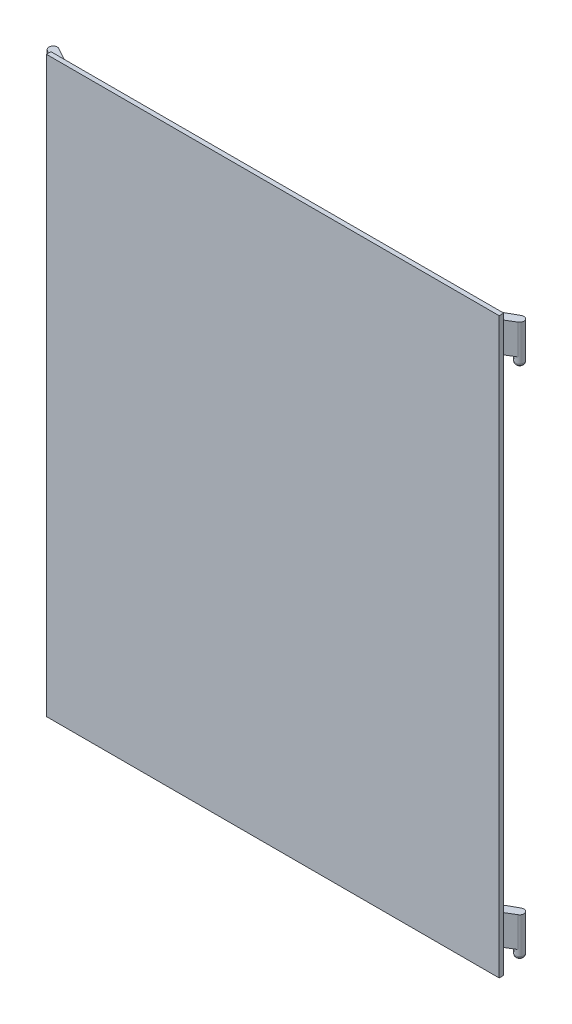
ISO-10303-21;
HEADER;
FILE_DESCRIPTION(('STEP AP214'),'2;1');
FILE_NAME('part.step','',(''),(''),'','','');
FILE_SCHEMA(('AUTOMOTIVE_DESIGN { 1 0 10303 214 1 1 1 1 }'));
ENDSEC;
DATA;
#1=APPLICATION_CONTEXT('core data for automotive mechanical design processes');
#2=APPLICATION_PROTOCOL_DEFINITION('international standard','automotive_design',2000,#1);
#3=PRODUCT_CONTEXT('',#1,'mechanical');
#4=PRODUCT('Part','Part','',(#3));
#5=PRODUCT_RELATED_PRODUCT_CATEGORY('part','',(#4));
#6=PRODUCT_DEFINITION_FORMATION('','',#4);
#7=PRODUCT_DEFINITION_CONTEXT('part definition',#1,'design');
#8=PRODUCT_DEFINITION('design','',#6,#7);
#9=PRODUCT_DEFINITION_SHAPE('','',#8);
#10=(LENGTH_UNIT() NAMED_UNIT(*) SI_UNIT(.MILLI.,.METRE.));
#11=(NAMED_UNIT(*) PLANE_ANGLE_UNIT() SI_UNIT($,.RADIAN.));
#12=(NAMED_UNIT(*) SI_UNIT($,.STERADIAN.) SOLID_ANGLE_UNIT());
#13=UNCERTAINTY_MEASURE_WITH_UNIT(LENGTH_MEASURE(1.E-05),#10,'distance_accuracy_value','');
#14=(GEOMETRIC_REPRESENTATION_CONTEXT(3) GLOBAL_UNCERTAINTY_ASSIGNED_CONTEXT((#13)) GLOBAL_UNIT_ASSIGNED_CONTEXT((#10,
#11,#12)) REPRESENTATION_CONTEXT('',''));
#15=CARTESIAN_POINT('',(0.,0.,0.));
#16=DIRECTION('',(0.,0.,1.));
#17=DIRECTION('',(1.,0.,0.));
#18=AXIS2_PLACEMENT_3D('',#15,#16,#17);
#19=CARTESIAN_POINT('',(-77.2720779386421,178.,-3.74999999999998));
#20=DIRECTION('',(0.,1.,0.));
#21=DIRECTION('',(-1.,0.,0.));
#22=AXIS2_PLACEMENT_3D('',#19,#20,#21);
#23=PLANE('',#22);
#24=CARTESIAN_POINT('',(-77.2720779386421,178.,-3.74999999999998));
#25=DIRECTION('',(0.,1.,0.));
#26=DIRECTION('',(-1.,0.,0.));
#27=AXIS2_PLACEMENT_3D('',#24,#25,#26);
#28=CIRCLE('',#27,1.4);
#29=CARTESIAN_POINT('',(-76.591446047137,178.,-4.97341335135191));
#30=VERTEX_POINT('',#29);
#31=CARTESIAN_POINT('',(-77.9935761934169,178.,-2.55023324418576));
#32=VERTEX_POINT('',#31);
#33=EDGE_CURVE('E207',#30,#32,#28,.F.);
#34=ORIENTED_EDGE('',*,*,#33,.F.);
#35=DIRECTION('',(-0.873866679537094,0.,-0.48616563678937));
#36=VECTOR('',#35,1.);
#37=CARTESIAN_POINT('',(-76.591446047137,178.,-4.9734133513519));
#38=LINE('',#37,#36);
#39=CARTESIAN_POINT('',(-71.2672047876485,178.,-2.01133320462906));
#40=VERTEX_POINT('',#39);
#41=EDGE_CURVE('E194',#40,#30,#38,.T.);
#42=ORIENTED_EDGE('',*,*,#41,.F.);
#43=CARTESIAN_POINT('',(-66.4055484197548,178.,-10.75));
#44=DIRECTION('',(0.,1.,0.));
#45=DIRECTION('',(-1.,0.,0.));
#46=AXIS2_PLACEMENT_3D('',#43,#44,#45);
#47=CIRCLE('',#46,10.);
#48=CARTESIAN_POINT('',(-66.4055484197548,178.,-0.75));
#49=VERTEX_POINT('',#48);
#50=EDGE_CURVE('E41',#40,#49,#47,.T.);
#51=ORIENTED_EDGE('',*,*,#50,.T.);
#52=DIRECTION('',(1.,0.,0.));
#53=VECTOR('',#52,1.);
#54=CARTESIAN_POINT('',(-75.,178.,-0.75));
#55=LINE('',#54,#53);
#56=CARTESIAN_POINT('',(-75.,178.,-0.75));
#57=VERTEX_POINT('',#56);
#58=EDGE_CURVE('E48',#57,#49,#55,.T.);
#59=ORIENTED_EDGE('',*,*,#58,.F.);
#60=DIRECTION('',(0.856976254153005,0.,0.515355896267701));
#61=VECTOR('',#60,1.);
#62=CARTESIAN_POINT('',(-75.,178.,-0.75));
#63=LINE('',#62,#61);
#64=EDGE_CURVE('E204',#32,#57,#63,.T.);
#65=ORIENTED_EDGE('',*,*,#64,.F.);
#66=EDGE_LOOP('',(#34,#42,#51,#59,#65));
#67=FACE_BOUND('',#66,.T.);
#68=ADVANCED_FACE('F33',(#67),#23,.F.);
#69=CARTESIAN_POINT('',(-77.2720779386421,7.99999999999998,-3.74999999999998));
#70=DIRECTION('',(0.,1.,0.));
#71=DIRECTION('',(-1.,0.,0.));
#72=AXIS2_PLACEMENT_3D('',#69,#70,#71);
#73=PLANE('',#72);
#74=CARTESIAN_POINT('',(-77.2720779386421,7.99999999999998,-3.74999999999998));
#75=DIRECTION('',(0.,1.,0.));
#76=DIRECTION('',(-1.,0.,0.));
#77=AXIS2_PLACEMENT_3D('',#74,#75,#76);
#78=CIRCLE('',#77,1.4);
#79=CARTESIAN_POINT('',(-76.591446047137,7.99999999999998,-4.97341335135191));
#80=VERTEX_POINT('',#79);
#81=CARTESIAN_POINT('',(-77.9935761934169,7.99999999999998,-2.55023324418576));
#82=VERTEX_POINT('',#81);
#83=EDGE_CURVE('E291',#80,#82,#78,.F.);
#84=ORIENTED_EDGE('',*,*,#83,.F.);
#85=DIRECTION('',(-0.873866679537094,0.,-0.48616563678937));
#86=VECTOR('',#85,1.);
#87=CARTESIAN_POINT('',(-76.591446047137,7.99999999999998,-4.9734133513519));
#88=LINE('',#87,#86);
#89=CARTESIAN_POINT('',(-71.2672047876485,7.99999999999998,-2.01133320462906));
#90=VERTEX_POINT('',#89);
#91=EDGE_CURVE('E284',#90,#80,#88,.T.);
#92=ORIENTED_EDGE('',*,*,#91,.F.);
#93=CARTESIAN_POINT('',(-66.4055484197548,7.99999999999998,-10.75));
#94=DIRECTION('',(0.,1.,0.));
#95=DIRECTION('',(-1.,0.,0.));
#96=AXIS2_PLACEMENT_3D('',#93,#94,#95);
#97=CIRCLE('',#96,10.);
#98=CARTESIAN_POINT('',(-66.4055484197548,7.99999999999998,-0.75));
#99=VERTEX_POINT('',#98);
#100=EDGE_CURVE('E306',#90,#99,#97,.T.);
#101=ORIENTED_EDGE('',*,*,#100,.T.);
#102=DIRECTION('',(1.,0.,0.));
#103=VECTOR('',#102,1.);
#104=CARTESIAN_POINT('',(-75.,7.99999999999998,-0.75));
#105=LINE('',#104,#103);
#106=CARTESIAN_POINT('',(-75.,7.99999999999995,-0.75));
#107=VERTEX_POINT('',#106);
#108=EDGE_CURVE('E275',#107,#99,#105,.T.);
#109=ORIENTED_EDGE('',*,*,#108,.F.);
#110=DIRECTION('',(0.856976254153005,0.,0.515355896267701));
#111=VECTOR('',#110,1.);
#112=CARTESIAN_POINT('',(-75.,7.99999999999998,-0.75));
#113=LINE('',#112,#111);
#114=EDGE_CURVE('E448',#82,#107,#113,.T.);
#115=ORIENTED_EDGE('',*,*,#114,.F.);
#116=EDGE_LOOP('',(#84,#92,#101,#109,#115));
#117=FACE_BOUND('',#116,.T.);
#118=ADVANCED_FACE('F432',(#117),#73,.F.);
#119=CARTESIAN_POINT('',(75.,340.007499812509,-0.75));
#120=DIRECTION('',(-1.,0.,0.));
#121=DIRECTION('',(0.,0.,1.));
#122=AXIS2_PLACEMENT_3D('',#119,#120,#121);
#123=PLANE('',#122);
#124=DIRECTION('',(0.,0.,-1.));
#125=VECTOR('',#124,1.);
#126=CARTESIAN_POINT('',(75.,190.,-0.75));
#127=LINE('',#126,#125);
#128=CARTESIAN_POINT('',(75.,190.,0.75));
#129=VERTEX_POINT('',#128);
#130=CARTESIAN_POINT('',(75.,190.,-0.75));
#131=VERTEX_POINT('',#130);
#132=EDGE_CURVE('E396',#129,#131,#127,.T.);
#133=ORIENTED_EDGE('',*,*,#132,.F.);
#134=DIRECTION('',(0.,-1.,0.));
#135=VECTOR('',#134,1.);
#136=CARTESIAN_POINT('',(75.,340.007499812509,0.75));
#137=LINE('',#136,#135);
#138=CARTESIAN_POINT('',(75.,0.,0.75));
#139=VERTEX_POINT('',#138);
#140=EDGE_CURVE('E365',#129,#139,#137,.T.);
#141=ORIENTED_EDGE('',*,*,#140,.T.);
#142=DIRECTION('',(0.,0.,-1.));
#143=VECTOR('',#142,1.);
#144=CARTESIAN_POINT('',(75.,0.,-0.75));
#145=LINE('',#144,#143);
#146=CARTESIAN_POINT('',(75.,0.,-0.75));
#147=VERTEX_POINT('',#146);
#148=EDGE_CURVE('E366',#139,#147,#145,.T.);
#149=ORIENTED_EDGE('',*,*,#148,.T.);
#150=DIRECTION('',(0.,-1.,0.));
#151=VECTOR('',#150,1.);
#152=CARTESIAN_POINT('',(75.,340.007499812509,-0.75));
#153=LINE('',#152,#151);
#154=CARTESIAN_POINT('',(75.,7.99999999999995,-0.75));
#155=VERTEX_POINT('',#154);
#156=EDGE_CURVE('E372',#155,#147,#153,.T.);
#157=ORIENTED_EDGE('',*,*,#156,.F.);
#158=DIRECTION('',(0.,-1.,0.));
#159=VECTOR('',#158,1.);
#160=CARTESIAN_POINT('',(75.,18.,-0.75));
#161=LINE('',#160,#159);
#162=CARTESIAN_POINT('',(75.,18.,-0.75));
#163=VERTEX_POINT('',#162);
#164=EDGE_CURVE('E272',#163,#155,#161,.T.);
#165=ORIENTED_EDGE('',*,*,#164,.F.);
#166=CARTESIAN_POINT('',(75.,178.,-0.75));
#167=VERTEX_POINT('',#166);
#168=EDGE_CURVE('E411',#167,#163,#153,.T.);
#169=ORIENTED_EDGE('',*,*,#168,.F.);
#170=DIRECTION('',(0.,-1.,0.));
#171=VECTOR('',#170,1.);
#172=CARTESIAN_POINT('',(75.,188.,-0.75));
#173=LINE('',#172,#171);
#174=CARTESIAN_POINT('',(75.,188.,-0.75));
#175=VERTEX_POINT('',#174);
#176=EDGE_CURVE('E246',#175,#167,#173,.T.);
#177=ORIENTED_EDGE('',*,*,#176,.F.);
#178=EDGE_CURVE('E354',#131,#175,#153,.T.);
#179=ORIENTED_EDGE('',*,*,#178,.F.);
#180=EDGE_LOOP('',(#133,#141,#149,#157,#165,#169,#177,#179));
#181=FACE_BOUND('',#180,.T.);
#182=ADVANCED_FACE('F407',(#181),#123,.F.);
#183=CARTESIAN_POINT('',(-75.,340.007499812509,-0.75));
#184=DIRECTION('',(0.,0.,1.));
#185=DIRECTION('',(1.,0.,0.));
#186=AXIS2_PLACEMENT_3D('',#183,#184,#185);
#187=PLANE('',#186);
#188=ORIENTED_EDGE('',*,*,#58,.T.);
#189=DIRECTION('',(0.,-1.,0.));
#190=VECTOR('',#189,1.);
#191=CARTESIAN_POINT('',(-66.4055484197548,188.,-0.75));
#192=LINE('',#191,#190);
#193=CARTESIAN_POINT('',(-66.4055484197548,188.,-0.750000000000001));
#194=VERTEX_POINT('',#193);
#195=EDGE_CURVE('E585',#49,#194,#192,.F.);
#196=ORIENTED_EDGE('',*,*,#195,.T.);
#197=DIRECTION('',(1.,0.,0.));
#198=VECTOR('',#197,1.);
#199=CARTESIAN_POINT('',(-75.,188.,-0.75));
#200=LINE('',#199,#198);
#201=CARTESIAN_POINT('',(-75.,188.,-0.75));
#202=VERTEX_POINT('',#201);
#203=EDGE_CURVE('E55',#202,#194,#200,.T.);
#204=ORIENTED_EDGE('',*,*,#203,.F.);
#205=DIRECTION('',(0.,-1.,0.));
#206=VECTOR('',#205,1.);
#207=CARTESIAN_POINT('',(-75.,340.007499812509,-0.75));
#208=LINE('',#207,#206);
#209=CARTESIAN_POINT('',(-75.,190.,-0.75));
#210=VERTEX_POINT('',#209);
#211=EDGE_CURVE('E348',#210,#202,#208,.T.);
#212=ORIENTED_EDGE('',*,*,#211,.F.);
#213=DIRECTION('',(-1.,0.,0.));
#214=VECTOR('',#213,1.);
#215=CARTESIAN_POINT('',(-75.,190.,-0.75));
#216=LINE('',#215,#214);
#217=EDGE_CURVE('E393',#131,#210,#216,.T.);
#218=ORIENTED_EDGE('',*,*,#217,.F.);
#219=ORIENTED_EDGE('',*,*,#178,.T.);
#220=DIRECTION('',(-1.,0.,0.));
#221=VECTOR('',#220,1.);
#222=CARTESIAN_POINT('',(75.,188.,-0.75));
#223=LINE('',#222,#221);
#224=CARTESIAN_POINT('',(66.4055484197548,188.,-0.750000000000001));
#225=VERTEX_POINT('',#224);
#226=EDGE_CURVE('E226',#175,#225,#223,.T.);
#227=ORIENTED_EDGE('',*,*,#226,.T.);
#228=DIRECTION('',(0.,-1.,0.));
#229=VECTOR('',#228,1.);
#230=CARTESIAN_POINT('',(66.4055484197549,340.007499812509,-0.75));
#231=LINE('',#230,#229);
#232=CARTESIAN_POINT('',(66.4055484197548,178.,-0.75));
#233=VERTEX_POINT('',#232);
#234=EDGE_CURVE('E337',#225,#233,#231,.T.);
#235=ORIENTED_EDGE('',*,*,#234,.T.);
#236=DIRECTION('',(-1.,0.,0.));
#237=VECTOR('',#236,1.);
#238=CARTESIAN_POINT('',(75.,178.,-0.75));
#239=LINE('',#238,#237);
#240=EDGE_CURVE('E217',#167,#233,#239,.T.);
#241=ORIENTED_EDGE('',*,*,#240,.F.);
#242=ORIENTED_EDGE('',*,*,#168,.T.);
#243=DIRECTION('',(-1.,0.,0.));
#244=VECTOR('',#243,1.);
#245=CARTESIAN_POINT('',(75.,18.,-0.75));
#246=LINE('',#245,#244);
#247=CARTESIAN_POINT('',(66.4055484197548,18.,-0.750000000000001));
#248=VERTEX_POINT('',#247);
#249=EDGE_CURVE('E250',#163,#248,#246,.T.);
#250=ORIENTED_EDGE('',*,*,#249,.T.);
#251=DIRECTION('',(0.,-1.,0.));
#252=VECTOR('',#251,1.);
#253=CARTESIAN_POINT('',(66.4055484197549,340.007499812509,-0.75));
#254=LINE('',#253,#252);
#255=CARTESIAN_POINT('',(66.4055484197548,7.99999999999998,-0.75));
#256=VERTEX_POINT('',#255);
#257=EDGE_CURVE('E319',#248,#256,#254,.T.);
#258=ORIENTED_EDGE('',*,*,#257,.T.);
#259=DIRECTION('',(-1.,0.,0.));
#260=VECTOR('',#259,1.);
#261=CARTESIAN_POINT('',(75.,7.99999999999998,-0.75));
#262=LINE('',#261,#260);
#263=EDGE_CURVE('E249',#155,#256,#262,.T.);
#264=ORIENTED_EDGE('',*,*,#263,.F.);
#265=ORIENTED_EDGE('',*,*,#156,.T.);
#266=DIRECTION('',(-1.,0.,0.));
#267=VECTOR('',#266,1.);
#268=CARTESIAN_POINT('',(-75.,0.,-0.75));
#269=LINE('',#268,#267);
#270=CARTESIAN_POINT('',(-75.,0.,-0.75));
#271=VERTEX_POINT('',#270);
#272=EDGE_CURVE('E388',#147,#271,#269,.T.);
#273=ORIENTED_EDGE('',*,*,#272,.T.);
#274=EDGE_CURVE('E349',#107,#271,#208,.T.);
#275=ORIENTED_EDGE('',*,*,#274,.F.);
#276=ORIENTED_EDGE('',*,*,#108,.T.);
#277=DIRECTION('',(0.,-1.,0.));
#278=VECTOR('',#277,1.);
#279=CARTESIAN_POINT('',(-66.4055484197548,18.,-0.75));
#280=LINE('',#279,#278);
#281=CARTESIAN_POINT('',(-66.4055484197548,18.,-0.750000000000001));
#282=VERTEX_POINT('',#281);
#283=EDGE_CURVE('E303',#99,#282,#280,.F.);
#284=ORIENTED_EDGE('',*,*,#283,.T.);
#285=DIRECTION('',(1.,0.,0.));
#286=VECTOR('',#285,1.);
#287=CARTESIAN_POINT('',(-75.,18.,-0.75));
#288=LINE('',#287,#286);
#289=CARTESIAN_POINT('',(-75.,18.,-0.75));
#290=VERTEX_POINT('',#289);
#291=EDGE_CURVE('E279',#290,#282,#288,.T.);
#292=ORIENTED_EDGE('',*,*,#291,.F.);
#293=EDGE_CURVE('E346',#57,#290,#208,.T.);
#294=ORIENTED_EDGE('',*,*,#293,.F.);
#295=EDGE_LOOP('',(#188,#196,#204,#212,#218,#219,#227,#235,#241,#242,#250,#258,#264,#265,#273,
#275,#276,#284,#292,#294));
#296=FACE_BOUND('',#295,.T.);
#297=ADVANCED_FACE('F414',(#296),#187,.F.);
#298=CARTESIAN_POINT('',(-75.,340.007499812509,-0.75));
#299=DIRECTION('',(1.,0.,0.));
#300=DIRECTION('',(0.,0.,-1.));
#301=AXIS2_PLACEMENT_3D('',#298,#299,#300);
#302=PLANE('',#301);
#303=DIRECTION('',(0.,0.,1.));
#304=VECTOR('',#303,1.);
#305=CARTESIAN_POINT('',(-75.,190.,-0.75));
#306=LINE('',#305,#304);
#307=CARTESIAN_POINT('',(-75.,190.,0.75));
#308=VERTEX_POINT('',#307);
#309=EDGE_CURVE('E294',#210,#308,#306,.T.);
#310=ORIENTED_EDGE('',*,*,#309,.F.);
#311=ORIENTED_EDGE('',*,*,#211,.T.);
#312=DIRECTION('',(0.,-1.,0.));
#313=VECTOR('',#312,1.);
#314=CARTESIAN_POINT('',(-75.,188.,-0.75));
#315=LINE('',#314,#313);
#316=EDGE_CURVE('E222',#202,#57,#315,.T.);
#317=ORIENTED_EDGE('',*,*,#316,.T.);
#318=ORIENTED_EDGE('',*,*,#293,.T.);
#319=DIRECTION('',(0.,-1.,0.));
#320=VECTOR('',#319,1.);
#321=CARTESIAN_POINT('',(-75.,18.,-0.75));
#322=LINE('',#321,#320);
#323=EDGE_CURVE('E381',#290,#107,#322,.T.);
#324=ORIENTED_EDGE('',*,*,#323,.T.);
#325=ORIENTED_EDGE('',*,*,#274,.T.);
#326=DIRECTION('',(0.,0.,1.));
#327=VECTOR('',#326,1.);
#328=CARTESIAN_POINT('',(-75.,0.,-0.75));
#329=LINE('',#328,#327);
#330=CARTESIAN_POINT('',(-75.,0.,0.75));
#331=VERTEX_POINT('',#330);
#332=EDGE_CURVE('E364',#271,#331,#329,.T.);
#333=ORIENTED_EDGE('',*,*,#332,.T.);
#334=DIRECTION('',(0.,-1.,0.));
#335=VECTOR('',#334,1.);
#336=CARTESIAN_POINT('',(-75.,340.007499812509,0.75));
#337=LINE('',#336,#335);
#338=EDGE_CURVE('E356',#308,#331,#337,.T.);
#339=ORIENTED_EDGE('',*,*,#338,.F.);
#340=EDGE_LOOP('',(#310,#311,#317,#318,#324,#325,#333,#339));
#341=FACE_BOUND('',#340,.T.);
#342=ADVANCED_FACE('F420',(#341),#302,.F.);
#343=CARTESIAN_POINT('',(-75.,340.007499812509,0.75));
#344=DIRECTION('',(0.,0.,-1.));
#345=DIRECTION('',(-1.,0.,0.));
#346=AXIS2_PLACEMENT_3D('',#343,#344,#345);
#347=PLANE('',#346);
#348=DIRECTION('',(1.,0.,0.));
#349=VECTOR('',#348,1.);
#350=CARTESIAN_POINT('',(-75.,190.,0.75));
#351=LINE('',#350,#349);
#352=EDGE_CURVE('E385',#308,#129,#351,.T.);
#353=ORIENTED_EDGE('',*,*,#352,.F.);
#354=ORIENTED_EDGE('',*,*,#338,.T.);
#355=DIRECTION('',(1.,0.,0.));
#356=VECTOR('',#355,1.);
#357=CARTESIAN_POINT('',(-75.,0.,0.75));
#358=LINE('',#357,#356);
#359=EDGE_CURVE('E383',#331,#139,#358,.T.);
#360=ORIENTED_EDGE('',*,*,#359,.T.);
#361=ORIENTED_EDGE('',*,*,#140,.F.);
#362=EDGE_LOOP('',(#353,#354,#360,#361));
#363=FACE_BOUND('',#362,.T.);
#364=ADVANCED_FACE('F403',(#363),#347,.F.);
#365=CARTESIAN_POINT('',(0.,0.,0.));
#366=DIRECTION('',(0.,1.,0.));
#367=DIRECTION('',(0.,0.,1.));
#368=AXIS2_PLACEMENT_3D('',#365,#366,#367);
#369=PLANE('',#368);
#370=ORIENTED_EDGE('',*,*,#148,.F.);
#371=ORIENTED_EDGE('',*,*,#359,.F.);
#372=ORIENTED_EDGE('',*,*,#332,.F.);
#373=ORIENTED_EDGE('',*,*,#272,.F.);
#374=EDGE_LOOP('',(#370,#371,#372,#373));
#375=FACE_BOUND('',#374,.T.);
#376=ADVANCED_FACE('F418',(#375),#369,.F.);
#377=CARTESIAN_POINT('',(-94.5,190.,-17.75));
#378=DIRECTION('',(0.,1.,0.));
#379=DIRECTION('',(1.,0.,0.));
#380=AXIS2_PLACEMENT_3D('',#377,#378,#379);
#381=PLANE('',#380);
#382=ORIENTED_EDGE('',*,*,#352,.T.);
#383=ORIENTED_EDGE('',*,*,#132,.T.);
#384=ORIENTED_EDGE('',*,*,#217,.T.);
#385=ORIENTED_EDGE('',*,*,#309,.T.);
#386=EDGE_LOOP('',(#382,#383,#384,#385));
#387=FACE_BOUND('',#386,.T.);
#388=ADVANCED_FACE('F401',(#387),#381,.T.);
#389=CARTESIAN_POINT('',(-76.591446047137,18.,-4.9734133513519));
#390=DIRECTION('',(-0.48616563678937,0.,0.873866679537094));
#391=DIRECTION('',(0.873866679537094,0.,0.48616563678937));
#392=AXIS2_PLACEMENT_3D('',#389,#390,#391);
#393=PLANE('',#392);
#394=DIRECTION('',(-0.873866679537094,0.,-0.48616563678937));
#395=VECTOR('',#394,1.);
#396=CARTESIAN_POINT('',(-76.591446047137,18.,-4.9734133513519));
#397=LINE('',#396,#395);
#398=CARTESIAN_POINT('',(-71.2672047876485,18.,-2.01133320462906));
#399=VERTEX_POINT('',#398);
#400=CARTESIAN_POINT('',(-76.591446047137,18.,-4.97341335135191));
#401=VERTEX_POINT('',#400);
#402=EDGE_CURVE('E276',#399,#401,#397,.T.);
#403=ORIENTED_EDGE('',*,*,#402,.F.);
#404=DIRECTION('',(0.,-1.,0.));
#405=VECTOR('',#404,1.);
#406=CARTESIAN_POINT('',(-71.2672047876485,7.99999999999998,-2.01133320462906));
#407=LINE('',#406,#405);
#408=EDGE_CURVE('E300',#399,#90,#407,.T.);
#409=ORIENTED_EDGE('',*,*,#408,.T.);
#410=ORIENTED_EDGE('',*,*,#91,.T.);
#411=DIRECTION('',(0.,-1.,0.));
#412=VECTOR('',#411,1.);
#413=CARTESIAN_POINT('',(-76.591446047137,18.,-4.97341335135191));
#414=LINE('',#413,#412);
#415=EDGE_CURVE('E367',#401,#80,#414,.T.);
#416=ORIENTED_EDGE('',*,*,#415,.F.);
#417=EDGE_LOOP('',(#403,#409,#410,#416));
#418=FACE_BOUND('',#417,.T.);
#419=ADVANCED_FACE('F441',(#418),#393,.F.);
#420=CARTESIAN_POINT('',(-77.2720779386421,18.,-3.74999999999998));
#421=DIRECTION('',(0.,-1.,0.));
#422=DIRECTION('',(1.,0.,0.));
#423=AXIS2_PLACEMENT_3D('',#420,#421,#422);
#424=CYLINDRICAL_SURFACE('',#423,1.4);
#425=CARTESIAN_POINT('',(-77.2720779386421,5.99999999999998,-3.74999999999998));
#426=DIRECTION('',(0.,-1.,0.));
#427=DIRECTION('',(1.,0.,0.));
#428=AXIS2_PLACEMENT_3D('',#425,#426,#427);
#429=CIRCLE('',#428,1.4);
#430=CARTESIAN_POINT('',(-75.8720779386421,5.99999999999998,-3.74999999999998));
#431=VERTEX_POINT('',#430);
#432=EDGE_CURVE('E297',#431,#431,#429,.F.);
#433=ORIENTED_EDGE('',*,*,#432,.T.);
#434=EDGE_LOOP('',(#433));
#435=FACE_BOUND('',#434,.T.);
#436=ORIENTED_EDGE('',*,*,#415,.T.);
#437=ORIENTED_EDGE('',*,*,#83,.T.);
#438=DIRECTION('',(0.,-1.,0.));
#439=VECTOR('',#438,1.);
#440=CARTESIAN_POINT('',(-77.9935761934169,18.,-2.55023324418576));
#441=LINE('',#440,#439);
#442=CARTESIAN_POINT('',(-77.9935761934169,18.,-2.55023324418576));
#443=VERTEX_POINT('',#442);
#444=EDGE_CURVE('E375',#443,#82,#441,.T.);
#445=ORIENTED_EDGE('',*,*,#444,.F.);
#446=CARTESIAN_POINT('',(-77.2720779386421,18.,-3.74999999999998));
#447=DIRECTION('',(0.,1.,0.));
#448=DIRECTION('',(-1.,0.,0.));
#449=AXIS2_PLACEMENT_3D('',#446,#447,#448);
#450=CIRCLE('',#449,1.4);
#451=EDGE_CURVE('E278',#401,#443,#450,.T.);
#452=ORIENTED_EDGE('',*,*,#451,.F.);
#453=EDGE_LOOP('',(#436,#437,#445,#452));
#454=FACE_BOUND('',#453,.T.);
#455=ADVANCED_FACE('F443',(#435,#454),#424,.T.);
#456=CARTESIAN_POINT('',(-75.,18.,-0.75));
#457=DIRECTION('',(0.515355896267701,0.,-0.856976254153005));
#458=DIRECTION('',(-0.856976254153005,0.,-0.515355896267701));
#459=AXIS2_PLACEMENT_3D('',#456,#457,#458);
#460=PLANE('',#459);
#461=ORIENTED_EDGE('',*,*,#114,.T.);
#462=ORIENTED_EDGE('',*,*,#323,.F.);
#463=DIRECTION('',(0.856976254153005,0.,0.515355896267701));
#464=VECTOR('',#463,1.);
#465=CARTESIAN_POINT('',(-75.,18.,-0.75));
#466=LINE('',#465,#464);
#467=EDGE_CURVE('E281',#443,#290,#466,.T.);
#468=ORIENTED_EDGE('',*,*,#467,.F.);
#469=ORIENTED_EDGE('',*,*,#444,.T.);
#470=EDGE_LOOP('',(#461,#462,#468,#469));
#471=FACE_BOUND('',#470,.T.);
#472=ADVANCED_FACE('F447',(#471),#460,.F.);
#473=CARTESIAN_POINT('',(-77.2720779386421,18.,-3.74999999999998));
#474=DIRECTION('',(0.,1.,0.));
#475=DIRECTION('',(-1.,0.,0.));
#476=AXIS2_PLACEMENT_3D('',#473,#474,#475);
#477=PLANE('',#476);
#478=ORIENTED_EDGE('',*,*,#291,.T.);
#479=CARTESIAN_POINT('',(-66.4055484197548,18.,-10.75));
#480=DIRECTION('',(0.,1.,0.));
#481=DIRECTION('',(-1.,0.,0.));
#482=AXIS2_PLACEMENT_3D('',#479,#480,#481);
#483=CIRCLE('',#482,10.);
#484=EDGE_CURVE('E309',#282,#399,#483,.F.);
#485=ORIENTED_EDGE('',*,*,#484,.T.);
#486=ORIENTED_EDGE('',*,*,#402,.T.);
#487=ORIENTED_EDGE('',*,*,#451,.T.);
#488=ORIENTED_EDGE('',*,*,#467,.T.);
#489=EDGE_LOOP('',(#478,#485,#486,#487,#488));
#490=FACE_BOUND('',#489,.T.);
#491=ADVANCED_FACE('F438',(#490),#477,.T.);
#492=CARTESIAN_POINT('',(-77.2720779386421,4.99999999999998,-3.74999999999998));
#493=DIRECTION('',(0.,-1.,0.));
#494=DIRECTION('',(1.,0.,0.));
#495=AXIS2_PLACEMENT_3D('',#492,#493,#494);
#496=PLANE('',#495);
#497=CARTESIAN_POINT('',(-77.2720779386421,4.99999999999998,-3.74999999999998));
#498=DIRECTION('',(0.,-1.,0.));
#499=DIRECTION('',(1.,0.,0.));
#500=AXIS2_PLACEMENT_3D('',#497,#498,#499);
#501=CIRCLE('',#500,0.400000000000001);
#502=CARTESIAN_POINT('',(-76.8720779386421,4.99999999999998,-3.74999999999998));
#503=VERTEX_POINT('',#502);
#504=EDGE_CURVE('E293',#503,#503,#501,.T.);
#505=ORIENTED_EDGE('',*,*,#504,.T.);
#506=EDGE_LOOP('',(#505));
#507=FACE_BOUND('',#506,.T.);
#508=ADVANCED_FACE('F462',(#507),#496,.T.);
#509=CARTESIAN_POINT('',(-77.2720779386421,5.99999999999998,-3.74999999999998));
#510=DIRECTION('',(0.,-1.,0.));
#511=DIRECTION('',(1.,0.,0.));
#512=AXIS2_PLACEMENT_3D('',#509,#510,#511);
#513=DEGENERATE_TOROIDAL_SURFACE('',#512,0.400000000000001,1.,.T.);
#514=ORIENTED_EDGE('',*,*,#432,.F.);
#515=EDGE_LOOP('',(#514));
#516=FACE_BOUND('',#515,.T.);
#517=ORIENTED_EDGE('',*,*,#504,.F.);
#518=EDGE_LOOP('',(#517));
#519=FACE_BOUND('',#518,.T.);
#520=ADVANCED_FACE('F538',(#516,#519),#513,.T.);
#521=CARTESIAN_POINT('',(-66.4055484197548,18.,-10.75));
#522=DIRECTION('',(0.,1.,0.));
#523=DIRECTION('',(-1.,0.,0.));
#524=AXIS2_PLACEMENT_3D('',#521,#522,#523);
#525=CYLINDRICAL_SURFACE('',#524,10.);
#526=ORIENTED_EDGE('',*,*,#484,.F.);
#527=ORIENTED_EDGE('',*,*,#283,.F.);
#528=ORIENTED_EDGE('',*,*,#100,.F.);
#529=ORIENTED_EDGE('',*,*,#408,.F.);
#530=EDGE_LOOP('',(#526,#527,#528,#529));
#531=FACE_BOUND('',#530,.T.);
#532=ADVANCED_FACE('F435',(#531),#525,.F.);
#533=CARTESIAN_POINT('',(75.,18.,-0.75));
#534=DIRECTION('',(0.515355896267701,0.,0.856976254153005));
#535=DIRECTION('',(0.856976254153005,0.,-0.515355896267701));
#536=AXIS2_PLACEMENT_3D('',#533,#534,#535);
#537=PLANE('',#536);
#538=DIRECTION('',(-0.856976254153005,0.,0.515355896267701));
#539=VECTOR('',#538,1.);
#540=CARTESIAN_POINT('',(75.,7.99999999999998,-0.75));
#541=LINE('',#540,#539);
#542=CARTESIAN_POINT('',(77.9935761934169,7.99999999999998,-2.55023324418576));
#543=VERTEX_POINT('',#542);
#544=EDGE_CURVE('E263',#543,#155,#541,.T.);
#545=ORIENTED_EDGE('',*,*,#544,.F.);
#546=DIRECTION('',(0.,-1.,0.));
#547=VECTOR('',#546,1.);
#548=CARTESIAN_POINT('',(77.9935761934169,18.,-2.55023324418576));
#549=LINE('',#548,#547);
#550=CARTESIAN_POINT('',(77.9935761934169,18.,-2.55023324418576));
#551=VERTEX_POINT('',#550);
#552=EDGE_CURVE('E269',#551,#543,#549,.T.);
#553=ORIENTED_EDGE('',*,*,#552,.F.);
#554=DIRECTION('',(-0.856976254153005,0.,0.515355896267701));
#555=VECTOR('',#554,1.);
#556=CARTESIAN_POINT('',(75.,18.,-0.75));
#557=LINE('',#556,#555);
#558=EDGE_CURVE('E252',#551,#163,#557,.T.);
#559=ORIENTED_EDGE('',*,*,#558,.T.);
#560=ORIENTED_EDGE('',*,*,#164,.T.);
#561=EDGE_LOOP('',(#545,#553,#559,#560));
#562=FACE_BOUND('',#561,.T.);
#563=ADVANCED_FACE('F532',(#562),#537,.T.);
#564=CARTESIAN_POINT('',(77.2720779386421,18.,-3.74999999999998));
#565=DIRECTION('',(0.,-1.,0.));
#566=DIRECTION('',(1.,0.,0.));
#567=AXIS2_PLACEMENT_3D('',#564,#565,#566);
#568=CYLINDRICAL_SURFACE('',#567,1.4);
#569=CARTESIAN_POINT('',(77.2720779386421,5.99999999999998,-3.74999999999998));
#570=DIRECTION('',(0.,-1.,0.));
#571=DIRECTION('',(1.,0.,0.));
#572=AXIS2_PLACEMENT_3D('',#569,#570,#571);
#573=CIRCLE('',#572,1.4);
#574=CARTESIAN_POINT('',(78.6720779386421,5.99999999999998,-3.74999999999998));
#575=VERTEX_POINT('',#574);
#576=EDGE_CURVE('E313',#575,#575,#573,.F.);
#577=ORIENTED_EDGE('',*,*,#576,.T.);
#578=EDGE_LOOP('',(#577));
#579=FACE_BOUND('',#578,.T.);
#580=ORIENTED_EDGE('',*,*,#552,.T.);
#581=CARTESIAN_POINT('',(77.2720779386421,7.99999999999998,-3.74999999999998));
#582=DIRECTION('',(0.,1.,0.));
#583=DIRECTION('',(-1.,0.,0.));
#584=AXIS2_PLACEMENT_3D('',#581,#582,#583);
#585=CIRCLE('',#584,1.4);
#586=CARTESIAN_POINT('',(76.591446047137,7.99999999999998,-4.97341335135191));
#587=VERTEX_POINT('',#586);
#588=EDGE_CURVE('E311',#587,#543,#585,.T.);
#589=ORIENTED_EDGE('',*,*,#588,.F.);
#590=DIRECTION('',(0.,-1.,0.));
#591=VECTOR('',#590,1.);
#592=CARTESIAN_POINT('',(76.591446047137,18.,-4.97341335135191));
#593=LINE('',#592,#591);
#594=CARTESIAN_POINT('',(76.591446047137,18.,-4.97341335135191));
#595=VERTEX_POINT('',#594);
#596=EDGE_CURVE('E261',#595,#587,#593,.T.);
#597=ORIENTED_EDGE('',*,*,#596,.F.);
#598=CARTESIAN_POINT('',(77.2720779386421,18.,-3.74999999999998));
#599=DIRECTION('',(0.,-1.,0.));
#600=DIRECTION('',(1.,0.,0.));
#601=AXIS2_PLACEMENT_3D('',#598,#599,#600);
#602=CIRCLE('',#601,1.4);
#603=EDGE_CURVE('E256',#595,#551,#602,.T.);
#604=ORIENTED_EDGE('',*,*,#603,.T.);
#605=EDGE_LOOP('',(#580,#589,#597,#604));
#606=FACE_BOUND('',#605,.T.);
#607=ADVANCED_FACE('F528',(#579,#606),#568,.T.);
#608=CARTESIAN_POINT('',(76.591446047137,18.,-4.9734133513519));
#609=DIRECTION('',(-0.48616563678937,0.,-0.873866679537094));
#610=DIRECTION('',(-0.873866679537094,0.,0.48616563678937));
#611=AXIS2_PLACEMENT_3D('',#608,#609,#610);
#612=PLANE('',#611);
#613=DIRECTION('',(0.873866679537094,0.,-0.48616563678937));
#614=VECTOR('',#613,1.);
#615=CARTESIAN_POINT('',(76.591446047137,7.99999999999998,-4.9734133513519));
#616=LINE('',#615,#614);
#617=CARTESIAN_POINT('',(71.2672047876485,7.99999999999998,-2.01133320462906));
#618=VERTEX_POINT('',#617);
#619=EDGE_CURVE('E253',#618,#587,#616,.T.);
#620=ORIENTED_EDGE('',*,*,#619,.F.);
#621=DIRECTION('',(0.,-1.,0.));
#622=VECTOR('',#621,1.);
#623=CARTESIAN_POINT('',(71.2672047876485,18.,-2.01133320462906));
#624=LINE('',#623,#622);
#625=CARTESIAN_POINT('',(71.2672047876485,18.,-2.01133320462906));
#626=VERTEX_POINT('',#625);
#627=EDGE_CURVE('E322',#618,#626,#624,.F.);
#628=ORIENTED_EDGE('',*,*,#627,.T.);
#629=DIRECTION('',(0.873866679537094,0.,-0.48616563678937));
#630=VECTOR('',#629,1.);
#631=CARTESIAN_POINT('',(76.591446047137,18.,-4.9734133513519));
#632=LINE('',#631,#630);
#633=EDGE_CURVE('E259',#626,#595,#632,.T.);
#634=ORIENTED_EDGE('',*,*,#633,.T.);
#635=ORIENTED_EDGE('',*,*,#596,.T.);
#636=EDGE_LOOP('',(#620,#628,#634,#635));
#637=FACE_BOUND('',#636,.T.);
#638=ADVANCED_FACE('F521',(#637),#612,.T.);
#639=CARTESIAN_POINT('',(77.2720779386421,18.,-3.74999999999998));
#640=DIRECTION('',(0.,1.,0.));
#641=DIRECTION('',(1.,0.,0.));
#642=AXIS2_PLACEMENT_3D('',#639,#640,#641);
#643=PLANE('',#642);
#644=ORIENTED_EDGE('',*,*,#249,.F.);
#645=ORIENTED_EDGE('',*,*,#558,.F.);
#646=ORIENTED_EDGE('',*,*,#603,.F.);
#647=ORIENTED_EDGE('',*,*,#633,.F.);
#648=CARTESIAN_POINT('',(66.4055484197548,18.,-10.75));
#649=DIRECTION('',(0.,1.,0.));
#650=DIRECTION('',(-1.,0.,0.));
#651=AXIS2_PLACEMENT_3D('',#648,#649,#650);
#652=CIRCLE('',#651,10.);
#653=EDGE_CURVE('E326',#626,#248,#652,.F.);
#654=ORIENTED_EDGE('',*,*,#653,.T.);
#655=EDGE_LOOP('',(#644,#645,#646,#647,#654));
#656=FACE_BOUND('',#655,.T.);
#657=ADVANCED_FACE('F518',(#656),#643,.T.);
#658=CARTESIAN_POINT('',(77.2720779386421,7.99999999999998,-3.74999999999998));
#659=DIRECTION('',(0.,1.,0.));
#660=DIRECTION('',(1.,0.,0.));
#661=AXIS2_PLACEMENT_3D('',#658,#659,#660);
#662=PLANE('',#661);
#663=ORIENTED_EDGE('',*,*,#263,.T.);
#664=CARTESIAN_POINT('',(66.4055484197548,7.99999999999995,-10.75));
#665=DIRECTION('',(0.,1.,0.));
#666=DIRECTION('',(-1.,0.,0.));
#667=AXIS2_PLACEMENT_3D('',#664,#665,#666);
#668=CIRCLE('',#667,10.);
#669=EDGE_CURVE('E324',#256,#618,#668,.T.);
#670=ORIENTED_EDGE('',*,*,#669,.T.);
#671=ORIENTED_EDGE('',*,*,#619,.T.);
#672=ORIENTED_EDGE('',*,*,#588,.T.);
#673=ORIENTED_EDGE('',*,*,#544,.T.);
#674=EDGE_LOOP('',(#663,#670,#671,#672,#673));
#675=FACE_BOUND('',#674,.T.);
#676=ADVANCED_FACE('F516',(#675),#662,.F.);
#677=CARTESIAN_POINT('',(77.2720779386421,4.99999999999998,-3.74999999999998));
#678=DIRECTION('',(0.,-1.,0.));
#679=DIRECTION('',(-1.,0.,0.));
#680=AXIS2_PLACEMENT_3D('',#677,#678,#679);
#681=PLANE('',#680);
#682=CARTESIAN_POINT('',(77.2720779386421,4.99999999999998,-3.74999999999998));
#683=DIRECTION('',(0.,-1.,0.));
#684=DIRECTION('',(1.,0.,0.));
#685=AXIS2_PLACEMENT_3D('',#682,#683,#684);
#686=CIRCLE('',#685,0.400000000000001);
#687=CARTESIAN_POINT('',(77.6720779386421,4.99999999999998,-3.74999999999998));
#688=VERTEX_POINT('',#687);
#689=EDGE_CURVE('E316',#688,#688,#686,.T.);
#690=ORIENTED_EDGE('',*,*,#689,.T.);
#691=EDGE_LOOP('',(#690));
#692=FACE_BOUND('',#691,.T.);
#693=ADVANCED_FACE('F512',(#692),#681,.T.);
#694=CARTESIAN_POINT('',(77.2720779386421,5.99999999999998,-3.74999999999998));
#695=DIRECTION('',(0.,-1.,0.));
#696=DIRECTION('',(1.,0.,0.));
#697=AXIS2_PLACEMENT_3D('',#694,#695,#696);
#698=DEGENERATE_TOROIDAL_SURFACE('',#697,0.400000000000001,1.,.T.);
#699=ORIENTED_EDGE('',*,*,#689,.F.);
#700=EDGE_LOOP('',(#699));
#701=FACE_BOUND('',#700,.T.);
#702=ORIENTED_EDGE('',*,*,#576,.F.);
#703=EDGE_LOOP('',(#702));
#704=FACE_BOUND('',#703,.T.);
#705=ADVANCED_FACE('F515',(#701,#704),#698,.T.);
#706=CARTESIAN_POINT('',(66.4055484197549,340.007499812509,-10.75));
#707=DIRECTION('',(0.,-1.,0.));
#708=DIRECTION('',(1.,0.,0.));
#709=AXIS2_PLACEMENT_3D('',#706,#707,#708);
#710=CYLINDRICAL_SURFACE('',#709,10.);
#711=ORIENTED_EDGE('',*,*,#653,.F.);
#712=ORIENTED_EDGE('',*,*,#627,.F.);
#713=ORIENTED_EDGE('',*,*,#669,.F.);
#714=ORIENTED_EDGE('',*,*,#257,.F.);
#715=EDGE_LOOP('',(#711,#712,#713,#714));
#716=FACE_BOUND('',#715,.T.);
#717=ADVANCED_FACE('F510',(#716),#710,.F.);
#718=CARTESIAN_POINT('',(75.,188.,-0.75));
#719=DIRECTION('',(0.515355896267701,0.,0.856976254153005));
#720=DIRECTION('',(0.856976254153005,0.,-0.515355896267701));
#721=AXIS2_PLACEMENT_3D('',#718,#719,#720);
#722=PLANE('',#721);
#723=DIRECTION('',(-0.856976254153005,0.,0.515355896267701));
#724=VECTOR('',#723,1.);
#725=CARTESIAN_POINT('',(75.,178.,-0.75));
#726=LINE('',#725,#724);
#727=CARTESIAN_POINT('',(77.9935761934169,178.,-2.55023324418576));
#728=VERTEX_POINT('',#727);
#729=EDGE_CURVE('E220',#728,#167,#726,.T.);
#730=ORIENTED_EDGE('',*,*,#729,.F.);
#731=DIRECTION('',(0.,-1.,0.));
#732=VECTOR('',#731,1.);
#733=CARTESIAN_POINT('',(77.9935761934169,188.,-2.55023324418576));
#734=LINE('',#733,#732);
#735=CARTESIAN_POINT('',(77.9935761934169,188.,-2.55023324418576));
#736=VERTEX_POINT('',#735);
#737=EDGE_CURVE('E243',#736,#728,#734,.T.);
#738=ORIENTED_EDGE('',*,*,#737,.F.);
#739=DIRECTION('',(-0.856976254153005,0.,0.515355896267701));
#740=VECTOR('',#739,1.);
#741=CARTESIAN_POINT('',(75.,188.,-0.75));
#742=LINE('',#741,#740);
#743=EDGE_CURVE('E228',#736,#175,#742,.T.);
#744=ORIENTED_EDGE('',*,*,#743,.T.);
#745=ORIENTED_EDGE('',*,*,#176,.T.);
#746=EDGE_LOOP('',(#730,#738,#744,#745));
#747=FACE_BOUND('',#746,.T.);
#748=ADVANCED_FACE('F506',(#747),#722,.T.);
#749=CARTESIAN_POINT('',(77.2720779386421,188.,-3.74999999999998));
#750=DIRECTION('',(0.,-1.,0.));
#751=DIRECTION('',(1.,0.,0.));
#752=AXIS2_PLACEMENT_3D('',#749,#750,#751);
#753=CYLINDRICAL_SURFACE('',#752,1.4);
#754=CARTESIAN_POINT('',(77.2720779386421,176.,-3.74999999999998));
#755=DIRECTION('',(0.,-1.,0.));
#756=DIRECTION('',(1.,0.,0.));
#757=AXIS2_PLACEMENT_3D('',#754,#755,#756);
#758=CIRCLE('',#757,1.4);
#759=CARTESIAN_POINT('',(78.6720779386421,176.,-3.74999999999998));
#760=VERTEX_POINT('',#759);
#761=EDGE_CURVE('E331',#760,#760,#758,.F.);
#762=ORIENTED_EDGE('',*,*,#761,.T.);
#763=EDGE_LOOP('',(#762));
#764=FACE_BOUND('',#763,.T.);
#765=ORIENTED_EDGE('',*,*,#737,.T.);
#766=CARTESIAN_POINT('',(77.2720779386421,178.,-3.74999999999998));
#767=DIRECTION('',(0.,1.,0.));
#768=DIRECTION('',(-1.,0.,0.));
#769=AXIS2_PLACEMENT_3D('',#766,#767,#768);
#770=CIRCLE('',#769,1.4);
#771=CARTESIAN_POINT('',(76.591446047137,178.,-4.97341335135191));
#772=VERTEX_POINT('',#771);
#773=EDGE_CURVE('E329',#772,#728,#770,.T.);
#774=ORIENTED_EDGE('',*,*,#773,.F.);
#775=DIRECTION('',(0.,-1.,0.));
#776=VECTOR('',#775,1.);
#777=CARTESIAN_POINT('',(76.591446047137,188.,-4.97341335135191));
#778=LINE('',#777,#776);
#779=CARTESIAN_POINT('',(76.591446047137,188.,-4.97341335135191));
#780=VERTEX_POINT('',#779);
#781=EDGE_CURVE('E236',#780,#772,#778,.T.);
#782=ORIENTED_EDGE('',*,*,#781,.F.);
#783=CARTESIAN_POINT('',(77.2720779386421,188.,-3.74999999999998));
#784=DIRECTION('',(0.,-1.,0.));
#785=DIRECTION('',(1.,0.,0.));
#786=AXIS2_PLACEMENT_3D('',#783,#784,#785);
#787=CIRCLE('',#786,1.4);
#788=EDGE_CURVE('E232',#780,#736,#787,.T.);
#789=ORIENTED_EDGE('',*,*,#788,.T.);
#790=EDGE_LOOP('',(#765,#774,#782,#789));
#791=FACE_BOUND('',#790,.T.);
#792=ADVANCED_FACE('F502',(#764,#791),#753,.T.);
#793=CARTESIAN_POINT('',(76.591446047137,188.,-4.9734133513519));
#794=DIRECTION('',(-0.48616563678937,0.,-0.873866679537094));
#795=DIRECTION('',(-0.873866679537094,0.,0.48616563678937));
#796=AXIS2_PLACEMENT_3D('',#793,#794,#795);
#797=PLANE('',#796);
#798=DIRECTION('',(0.873866679537094,0.,-0.48616563678937));
#799=VECTOR('',#798,1.);
#800=CARTESIAN_POINT('',(76.591446047137,178.,-4.9734133513519));
#801=LINE('',#800,#799);
#802=CARTESIAN_POINT('',(71.2672047876485,178.,-2.01133320462906));
#803=VERTEX_POINT('',#802);
#804=EDGE_CURVE('E229',#803,#772,#801,.T.);
#805=ORIENTED_EDGE('',*,*,#804,.F.);
#806=DIRECTION('',(0.,-1.,0.));
#807=VECTOR('',#806,1.);
#808=CARTESIAN_POINT('',(71.2672047876485,188.,-2.01133320462906));
#809=LINE('',#808,#807);
#810=CARTESIAN_POINT('',(71.2672047876485,188.,-2.01133320462906));
#811=VERTEX_POINT('',#810);
#812=EDGE_CURVE('E340',#803,#811,#809,.F.);
#813=ORIENTED_EDGE('',*,*,#812,.T.);
#814=DIRECTION('',(0.873866679537094,0.,-0.48616563678937));
#815=VECTOR('',#814,1.);
#816=CARTESIAN_POINT('',(76.591446047137,188.,-4.9734133513519));
#817=LINE('',#816,#815);
#818=EDGE_CURVE('E235',#811,#780,#817,.T.);
#819=ORIENTED_EDGE('',*,*,#818,.T.);
#820=ORIENTED_EDGE('',*,*,#781,.T.);
#821=EDGE_LOOP('',(#805,#813,#819,#820));
#822=FACE_BOUND('',#821,.T.);
#823=ADVANCED_FACE('F495',(#822),#797,.T.);
#824=CARTESIAN_POINT('',(77.2720779386421,188.,-3.74999999999998));
#825=DIRECTION('',(0.,1.,0.));
#826=DIRECTION('',(1.,0.,0.));
#827=AXIS2_PLACEMENT_3D('',#824,#825,#826);
#828=PLANE('',#827);
#829=ORIENTED_EDGE('',*,*,#226,.F.);
#830=ORIENTED_EDGE('',*,*,#743,.F.);
#831=ORIENTED_EDGE('',*,*,#788,.F.);
#832=ORIENTED_EDGE('',*,*,#818,.F.);
#833=CARTESIAN_POINT('',(66.4055484197548,188.,-10.75));
#834=DIRECTION('',(0.,1.,0.));
#835=DIRECTION('',(-1.,0.,0.));
#836=AXIS2_PLACEMENT_3D('',#833,#834,#835);
#837=CIRCLE('',#836,10.);
#838=EDGE_CURVE('E213',#811,#225,#837,.F.);
#839=ORIENTED_EDGE('',*,*,#838,.T.);
#840=EDGE_LOOP('',(#829,#830,#831,#832,#839));
#841=FACE_BOUND('',#840,.T.);
#842=ADVANCED_FACE('F492',(#841),#828,.T.);
#843=CARTESIAN_POINT('',(77.2720779386421,178.,-3.74999999999998));
#844=DIRECTION('',(0.,1.,0.));
#845=DIRECTION('',(1.,0.,0.));
#846=AXIS2_PLACEMENT_3D('',#843,#844,#845);
#847=PLANE('',#846);
#848=ORIENTED_EDGE('',*,*,#240,.T.);
#849=CARTESIAN_POINT('',(66.4055484197548,178.,-10.75));
#850=DIRECTION('',(0.,1.,0.));
#851=DIRECTION('',(-1.,0.,0.));
#852=AXIS2_PLACEMENT_3D('',#849,#850,#851);
#853=CIRCLE('',#852,10.);
#854=EDGE_CURVE('E342',#233,#803,#853,.T.);
#855=ORIENTED_EDGE('',*,*,#854,.T.);
#856=ORIENTED_EDGE('',*,*,#804,.T.);
#857=ORIENTED_EDGE('',*,*,#773,.T.);
#858=ORIENTED_EDGE('',*,*,#729,.T.);
#859=EDGE_LOOP('',(#848,#855,#856,#857,#858));
#860=FACE_BOUND('',#859,.T.);
#861=ADVANCED_FACE('F490',(#860),#847,.F.);
#862=CARTESIAN_POINT('',(77.2720779386421,175.,-3.74999999999998));
#863=DIRECTION('',(0.,-1.,0.));
#864=DIRECTION('',(-1.,0.,0.));
#865=AXIS2_PLACEMENT_3D('',#862,#863,#864);
#866=PLANE('',#865);
#867=CARTESIAN_POINT('',(77.2720779386421,175.,-3.74999999999998));
#868=DIRECTION('',(0.,-1.,0.));
#869=DIRECTION('',(1.,0.,0.));
#870=AXIS2_PLACEMENT_3D('',#867,#868,#869);
#871=CIRCLE('',#870,0.400000000000001);
#872=CARTESIAN_POINT('',(77.6720779386421,175.,-3.74999999999998));
#873=VERTEX_POINT('',#872);
#874=EDGE_CURVE('E334',#873,#873,#871,.T.);
#875=ORIENTED_EDGE('',*,*,#874,.T.);
#876=EDGE_LOOP('',(#875));
#877=FACE_BOUND('',#876,.T.);
#878=ADVANCED_FACE('F486',(#877),#866,.T.);
#879=CARTESIAN_POINT('',(77.2720779386421,176.,-3.74999999999998));
#880=DIRECTION('',(0.,-1.,0.));
#881=DIRECTION('',(1.,0.,0.));
#882=AXIS2_PLACEMENT_3D('',#879,#880,#881);
#883=DEGENERATE_TOROIDAL_SURFACE('',#882,0.400000000000001,1.,.T.);
#884=ORIENTED_EDGE('',*,*,#874,.F.);
#885=EDGE_LOOP('',(#884));
#886=FACE_BOUND('',#885,.T.);
#887=ORIENTED_EDGE('',*,*,#761,.F.);
#888=EDGE_LOOP('',(#887));
#889=FACE_BOUND('',#888,.T.);
#890=ADVANCED_FACE('F489',(#886,#889),#883,.T.);
#891=CARTESIAN_POINT('',(66.4055484197549,340.007499812509,-10.75));
#892=DIRECTION('',(0.,-1.,0.));
#893=DIRECTION('',(1.,0.,0.));
#894=AXIS2_PLACEMENT_3D('',#891,#892,#893);
#895=CYLINDRICAL_SURFACE('',#894,10.);
#896=ORIENTED_EDGE('',*,*,#838,.F.);
#897=ORIENTED_EDGE('',*,*,#812,.F.);
#898=ORIENTED_EDGE('',*,*,#854,.F.);
#899=ORIENTED_EDGE('',*,*,#234,.F.);
#900=EDGE_LOOP('',(#896,#897,#898,#899));
#901=FACE_BOUND('',#900,.T.);
#902=ADVANCED_FACE('F485',(#901),#895,.F.);
#903=CARTESIAN_POINT('',(-76.591446047137,188.,-4.9734133513519));
#904=DIRECTION('',(-0.48616563678937,0.,0.873866679537094));
#905=DIRECTION('',(0.873866679537094,0.,0.48616563678937));
#906=AXIS2_PLACEMENT_3D('',#903,#904,#905);
#907=PLANE('',#906);
#908=DIRECTION('',(-0.873866679537094,0.,-0.48616563678937));
#909=VECTOR('',#908,1.);
#910=CARTESIAN_POINT('',(-76.591446047137,188.,-4.9734133513519));
#911=LINE('',#910,#909);
#912=CARTESIAN_POINT('',(-71.2672047876485,188.,-2.01133320462906));
#913=VERTEX_POINT('',#912);
#914=CARTESIAN_POINT('',(-76.591446047137,188.,-4.97341335135191));
#915=VERTEX_POINT('',#914);
#916=EDGE_CURVE('E589',#913,#915,#911,.T.);
#917=ORIENTED_EDGE('',*,*,#916,.F.);
#918=DIRECTION('',(0.,-1.,0.));
#919=VECTOR('',#918,1.);
#920=CARTESIAN_POINT('',(-71.2672047876485,178.,-2.01133320462906));
#921=LINE('',#920,#919);
#922=EDGE_CURVE('E202',#913,#40,#921,.T.);
#923=ORIENTED_EDGE('',*,*,#922,.T.);
#924=ORIENTED_EDGE('',*,*,#41,.T.);
#925=DIRECTION('',(0.,-1.,0.));
#926=VECTOR('',#925,1.);
#927=CARTESIAN_POINT('',(-76.591446047137,188.,-4.97341335135191));
#928=LINE('',#927,#926);
#929=EDGE_CURVE('E199',#915,#30,#928,.T.);
#930=ORIENTED_EDGE('',*,*,#929,.F.);
#931=EDGE_LOOP('',(#917,#923,#924,#930));
#932=FACE_BOUND('',#931,.T.);
#933=ADVANCED_FACE('F197',(#932),#907,.F.);
#934=CARTESIAN_POINT('',(-77.2720779386421,188.,-3.74999999999998));
#935=DIRECTION('',(0.,-1.,0.));
#936=DIRECTION('',(1.,0.,0.));
#937=AXIS2_PLACEMENT_3D('',#934,#935,#936);
#938=CYLINDRICAL_SURFACE('',#937,1.4);
#939=CARTESIAN_POINT('',(-77.2720779386421,176.,-3.74999999999998));
#940=DIRECTION('',(0.,-1.,0.));
#941=DIRECTION('',(1.,0.,0.));
#942=AXIS2_PLACEMENT_3D('',#939,#940,#941);
#943=CIRCLE('',#942,1.4);
#944=CARTESIAN_POINT('',(-75.8720779386421,176.,-3.74999999999998));
#945=VERTEX_POINT('',#944);
#946=EDGE_CURVE('E579',#945,#945,#943,.F.);
#947=ORIENTED_EDGE('',*,*,#946,.T.);
#948=EDGE_LOOP('',(#947));
#949=FACE_BOUND('',#948,.T.);
#950=ORIENTED_EDGE('',*,*,#929,.T.);
#951=ORIENTED_EDGE('',*,*,#33,.T.);
#952=DIRECTION('',(0.,-1.,0.));
#953=VECTOR('',#952,1.);
#954=CARTESIAN_POINT('',(-77.9935761934169,188.,-2.55023324418576));
#955=LINE('',#954,#953);
#956=CARTESIAN_POINT('',(-77.9935761934169,188.,-2.55023324418576));
#957=VERTEX_POINT('',#956);
#958=EDGE_CURVE('E218',#957,#32,#955,.T.);
#959=ORIENTED_EDGE('',*,*,#958,.F.);
#960=CARTESIAN_POINT('',(-77.2720779386421,188.,-3.74999999999998));
#961=DIRECTION('',(0.,1.,0.));
#962=DIRECTION('',(-1.,0.,0.));
#963=AXIS2_PLACEMENT_3D('',#960,#961,#962);
#964=CIRCLE('',#963,1.4);
#965=EDGE_CURVE('E216',#915,#957,#964,.T.);
#966=ORIENTED_EDGE('',*,*,#965,.F.);
#967=EDGE_LOOP('',(#950,#951,#959,#966));
#968=FACE_BOUND('',#967,.T.);
#969=ADVANCED_FACE('F215',(#949,#968),#938,.T.);
#970=CARTESIAN_POINT('',(-75.,188.,-0.75));
#971=DIRECTION('',(0.515355896267701,0.,-0.856976254153005));
#972=DIRECTION('',(-0.856976254153005,0.,-0.515355896267701));
#973=AXIS2_PLACEMENT_3D('',#970,#971,#972);
#974=PLANE('',#973);
#975=ORIENTED_EDGE('',*,*,#64,.T.);
#976=ORIENTED_EDGE('',*,*,#316,.F.);
#977=DIRECTION('',(0.856976254153005,0.,0.515355896267701));
#978=VECTOR('',#977,1.);
#979=CARTESIAN_POINT('',(-75.,188.,-0.75));
#980=LINE('',#979,#978);
#981=EDGE_CURVE('E594',#957,#202,#980,.T.);
#982=ORIENTED_EDGE('',*,*,#981,.F.);
#983=ORIENTED_EDGE('',*,*,#958,.T.);
#984=EDGE_LOOP('',(#975,#976,#982,#983));
#985=FACE_BOUND('',#984,.T.);
#986=ADVANCED_FACE('F476',(#985),#974,.F.);
#987=CARTESIAN_POINT('',(-77.2720779386421,188.,-3.74999999999998));
#988=DIRECTION('',(0.,1.,0.));
#989=DIRECTION('',(-1.,0.,0.));
#990=AXIS2_PLACEMENT_3D('',#987,#988,#989);
#991=PLANE('',#990);
#992=ORIENTED_EDGE('',*,*,#203,.T.);
#993=CARTESIAN_POINT('',(-66.4055484197548,188.,-10.75));
#994=DIRECTION('',(0.,1.,0.));
#995=DIRECTION('',(-1.,0.,0.));
#996=AXIS2_PLACEMENT_3D('',#993,#994,#995);
#997=CIRCLE('',#996,10.);
#998=EDGE_CURVE('E11',#194,#913,#997,.F.);
#999=ORIENTED_EDGE('',*,*,#998,.T.);
#1000=ORIENTED_EDGE('',*,*,#916,.T.);
#1001=ORIENTED_EDGE('',*,*,#965,.T.);
#1002=ORIENTED_EDGE('',*,*,#981,.T.);
#1003=EDGE_LOOP('',(#992,#999,#1000,#1001,#1002));
#1004=FACE_BOUND('',#1003,.T.);
#1005=ADVANCED_FACE('F474',(#1004),#991,.T.);
#1006=CARTESIAN_POINT('',(-77.2720779386421,175.,-3.74999999999998));
#1007=DIRECTION('',(0.,-1.,0.));
#1008=DIRECTION('',(1.,0.,0.));
#1009=AXIS2_PLACEMENT_3D('',#1006,#1007,#1008);
#1010=PLANE('',#1009);
#1011=CARTESIAN_POINT('',(-77.2720779386421,175.,-3.74999999999998));
#1012=DIRECTION('',(0.,-1.,0.));
#1013=DIRECTION('',(1.,0.,0.));
#1014=AXIS2_PLACEMENT_3D('',#1011,#1012,#1013);
#1015=CIRCLE('',#1014,0.400000000000001);
#1016=CARTESIAN_POINT('',(-76.8720779386421,175.,-3.74999999999998));
#1017=VERTEX_POINT('',#1016);
#1018=EDGE_CURVE('E212',#1017,#1017,#1015,.T.);
#1019=ORIENTED_EDGE('',*,*,#1018,.T.);
#1020=EDGE_LOOP('',(#1019));
#1021=FACE_BOUND('',#1020,.T.);
#1022=ADVANCED_FACE('F568',(#1021),#1010,.T.);
#1023=CARTESIAN_POINT('',(-77.2720779386421,176.,-3.74999999999998));
#1024=DIRECTION('',(0.,-1.,0.));
#1025=DIRECTION('',(1.,0.,0.));
#1026=AXIS2_PLACEMENT_3D('',#1023,#1024,#1025);
#1027=DEGENERATE_TOROIDAL_SURFACE('',#1026,0.400000000000001,1.,.T.);
#1028=ORIENTED_EDGE('',*,*,#946,.F.);
#1029=EDGE_LOOP('',(#1028));
#1030=FACE_BOUND('',#1029,.T.);
#1031=ORIENTED_EDGE('',*,*,#1018,.F.);
#1032=EDGE_LOOP('',(#1031));
#1033=FACE_BOUND('',#1032,.T.);
#1034=ADVANCED_FACE('F566',(#1030,#1033),#1027,.T.);
#1035=CARTESIAN_POINT('',(-66.4055484197548,188.,-10.75));
#1036=DIRECTION('',(0.,1.,0.));
#1037=DIRECTION('',(-1.,0.,0.));
#1038=AXIS2_PLACEMENT_3D('',#1035,#1036,#1037);
#1039=CYLINDRICAL_SURFACE('',#1038,10.);
#1040=ORIENTED_EDGE('',*,*,#998,.F.);
#1041=ORIENTED_EDGE('',*,*,#195,.F.);
#1042=ORIENTED_EDGE('',*,*,#50,.F.);
#1043=ORIENTED_EDGE('',*,*,#922,.F.);
#1044=EDGE_LOOP('',(#1040,#1041,#1042,#1043));
#1045=FACE_BOUND('',#1044,.T.);
#1046=ADVANCED_FACE('F35',(#1045),#1039,.F.);
#1047=CLOSED_SHELL('',(#68,#118,#182,#297,#342,#364,#376,#388,#419,#455,#472,#491,#508,#520,
#532,#563,#607,#638,#657,#676,#693,#705,#717,#748,#792,#823,#842,#861,#878,#890,#902,#933,#969,
#986,#1005,#1022,#1034,#1046));
#1048=MANIFOLD_SOLID_BREP('B2',#1047);
#1049=ADVANCED_BREP_SHAPE_REPRESENTATION('',(#18,#1048),#14);
#1050=SHAPE_DEFINITION_REPRESENTATION(#9,#1049);
ENDSEC;
END-ISO-10303-21;
